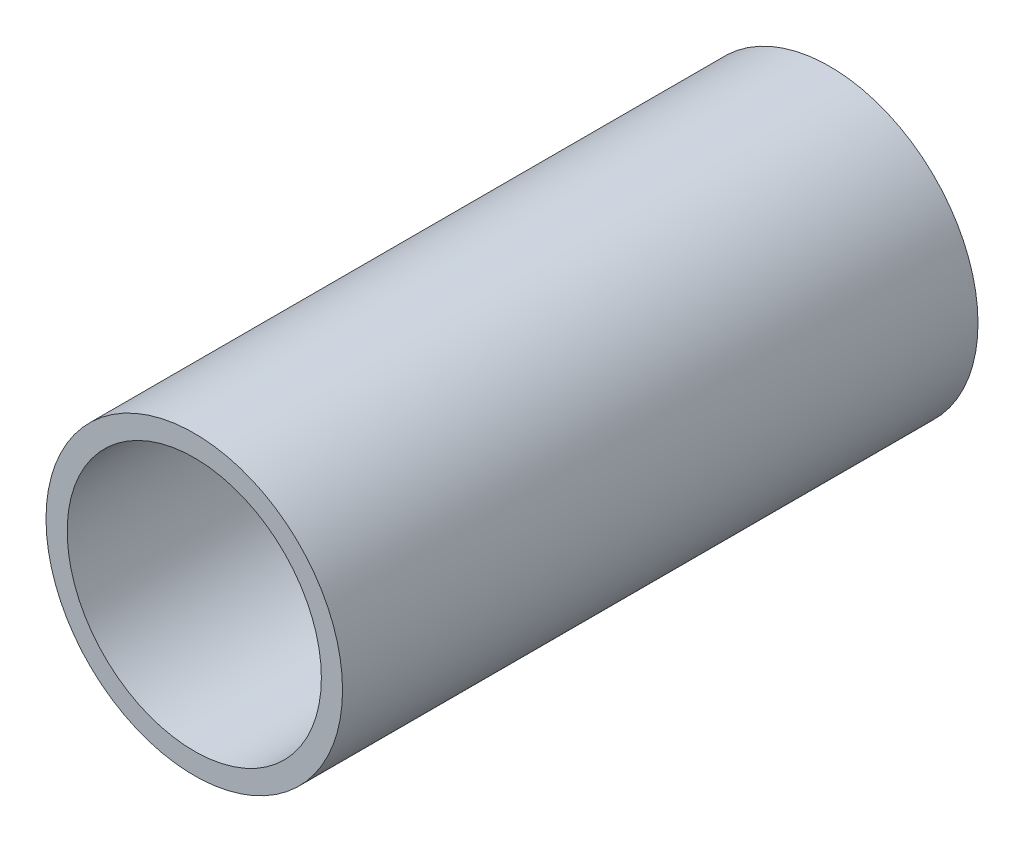
ISO-10303-21;
HEADER;
FILE_DESCRIPTION(('STEP AP214'),'2;1');
FILE_NAME('part.step','',(''),(''),'','','');
FILE_SCHEMA(('AUTOMOTIVE_DESIGN { 1 0 10303 214 1 1 1 1 }'));
ENDSEC;
DATA;
#1=APPLICATION_CONTEXT('core data for automotive mechanical design processes');
#2=APPLICATION_PROTOCOL_DEFINITION('international standard','automotive_design',2000,#1);
#3=PRODUCT_CONTEXT('',#1,'mechanical');
#4=PRODUCT('Part','Part','',(#3));
#5=PRODUCT_RELATED_PRODUCT_CATEGORY('part','',(#4));
#6=PRODUCT_DEFINITION_FORMATION('','',#4);
#7=PRODUCT_DEFINITION_CONTEXT('part definition',#1,'design');
#8=PRODUCT_DEFINITION('design','',#6,#7);
#9=PRODUCT_DEFINITION_SHAPE('','',#8);
#10=(LENGTH_UNIT() NAMED_UNIT(*) SI_UNIT(.MILLI.,.METRE.));
#11=(NAMED_UNIT(*) PLANE_ANGLE_UNIT() SI_UNIT($,.RADIAN.));
#12=(NAMED_UNIT(*) SI_UNIT($,.STERADIAN.) SOLID_ANGLE_UNIT());
#13=UNCERTAINTY_MEASURE_WITH_UNIT(LENGTH_MEASURE(1.E-05),#10,'distance_accuracy_value','');
#14=(GEOMETRIC_REPRESENTATION_CONTEXT(3) GLOBAL_UNCERTAINTY_ASSIGNED_CONTEXT((#13)) GLOBAL_UNIT_ASSIGNED_CONTEXT((#10,
#11,#12)) REPRESENTATION_CONTEXT('',''));
#15=CARTESIAN_POINT('',(0.,0.,0.));
#16=DIRECTION('',(0.,0.,1.));
#17=DIRECTION('',(1.,0.,0.));
#18=AXIS2_PLACEMENT_3D('',#15,#16,#17);
#19=CARTESIAN_POINT('',(0.,0.,15.));
#20=DIRECTION('',(0.,0.,-1.));
#21=DIRECTION('',(-1.,0.,0.));
#22=AXIS2_PLACEMENT_3D('',#19,#20,#21);
#23=CYLINDRICAL_SURFACE('',#22,3.5);
#24=CARTESIAN_POINT('',(0.,0.,15.));
#25=DIRECTION('',(0.,0.,1.));
#26=DIRECTION('',(1.,0.,0.));
#27=AXIS2_PLACEMENT_3D('',#24,#25,#26);
#28=CIRCLE('',#27,3.5);
#29=CARTESIAN_POINT('',(3.5,0.,15.));
#30=VERTEX_POINT('',#29);
#31=EDGE_CURVE('E10',#30,#30,#28,.T.);
#32=ORIENTED_EDGE('',*,*,#31,.F.);
#33=EDGE_LOOP('',(#32));
#34=FACE_BOUND('',#33,.T.);
#35=CARTESIAN_POINT('',(0.,0.,0.));
#36=DIRECTION('',(0.,0.,1.));
#37=DIRECTION('',(1.,0.,0.));
#38=AXIS2_PLACEMENT_3D('',#35,#36,#37);
#39=CIRCLE('',#38,3.5);
#40=CARTESIAN_POINT('',(3.5,0.,0.));
#41=VERTEX_POINT('',#40);
#42=EDGE_CURVE('E37',#41,#41,#39,.T.);
#43=ORIENTED_EDGE('',*,*,#42,.T.);
#44=EDGE_LOOP('',(#43));
#45=FACE_BOUND('',#44,.T.);
#46=ADVANCED_FACE('F40',(#34,#45),#23,.T.);
#47=CARTESIAN_POINT('',(0.,0.,15.));
#48=DIRECTION('',(0.,0.,1.));
#49=DIRECTION('',(1.,0.,0.));
#50=AXIS2_PLACEMENT_3D('',#47,#48,#49);
#51=PLANE('',#50);
#52=CARTESIAN_POINT('',(0.,0.,15.));
#53=DIRECTION('',(0.,0.,1.));
#54=DIRECTION('',(1.,0.,0.));
#55=AXIS2_PLACEMENT_3D('',#52,#53,#54);
#56=CIRCLE('',#55,3.);
#57=CARTESIAN_POINT('',(3.,0.,15.));
#58=VERTEX_POINT('',#57);
#59=EDGE_CURVE('E47',#58,#58,#56,.T.);
#60=ORIENTED_EDGE('',*,*,#59,.F.);
#61=EDGE_LOOP('',(#60));
#62=FACE_BOUND('',#61,.T.);
#63=ORIENTED_EDGE('',*,*,#31,.T.);
#64=EDGE_LOOP('',(#63));
#65=FACE_BOUND('',#64,.T.);
#66=ADVANCED_FACE('F64',(#62,#65),#51,.T.);
#67=CARTESIAN_POINT('',(0.,0.,0.));
#68=DIRECTION('',(0.,0.,1.));
#69=DIRECTION('',(1.,0.,0.));
#70=AXIS2_PLACEMENT_3D('',#67,#68,#69);
#71=PLANE('',#70);
#72=CARTESIAN_POINT('',(0.,0.,0.));
#73=DIRECTION('',(0.,0.,1.));
#74=DIRECTION('',(1.,0.,0.));
#75=AXIS2_PLACEMENT_3D('',#72,#73,#74);
#76=CIRCLE('',#75,3.);
#77=CARTESIAN_POINT('',(3.,0.,0.));
#78=VERTEX_POINT('',#77);
#79=EDGE_CURVE('E50',#78,#78,#76,.T.);
#80=ORIENTED_EDGE('',*,*,#79,.T.);
#81=EDGE_LOOP('',(#80));
#82=FACE_BOUND('',#81,.T.);
#83=ORIENTED_EDGE('',*,*,#42,.F.);
#84=EDGE_LOOP('',(#83));
#85=FACE_BOUND('',#84,.T.);
#86=ADVANCED_FACE('F54',(#82,#85),#71,.F.);
#87=CARTESIAN_POINT('',(0.,0.,0.));
#88=DIRECTION('',(0.,0.,1.));
#89=DIRECTION('',(1.,0.,0.));
#90=AXIS2_PLACEMENT_3D('',#87,#88,#89);
#91=CYLINDRICAL_SURFACE('',#90,3.);
#92=ORIENTED_EDGE('',*,*,#79,.F.);
#93=EDGE_LOOP('',(#92));
#94=FACE_BOUND('',#93,.T.);
#95=ORIENTED_EDGE('',*,*,#59,.T.);
#96=EDGE_LOOP('',(#95));
#97=FACE_BOUND('',#96,.T.);
#98=ADVANCED_FACE('F59',(#94,#97),#91,.F.);
#99=CLOSED_SHELL('',(#46,#66,#86,#98));
#100=MANIFOLD_SOLID_BREP('B2',#99);
#101=ADVANCED_BREP_SHAPE_REPRESENTATION('',(#18,#100),#14);
#102=SHAPE_DEFINITION_REPRESENTATION(#9,#101);
ENDSEC;
END-ISO-10303-21;
